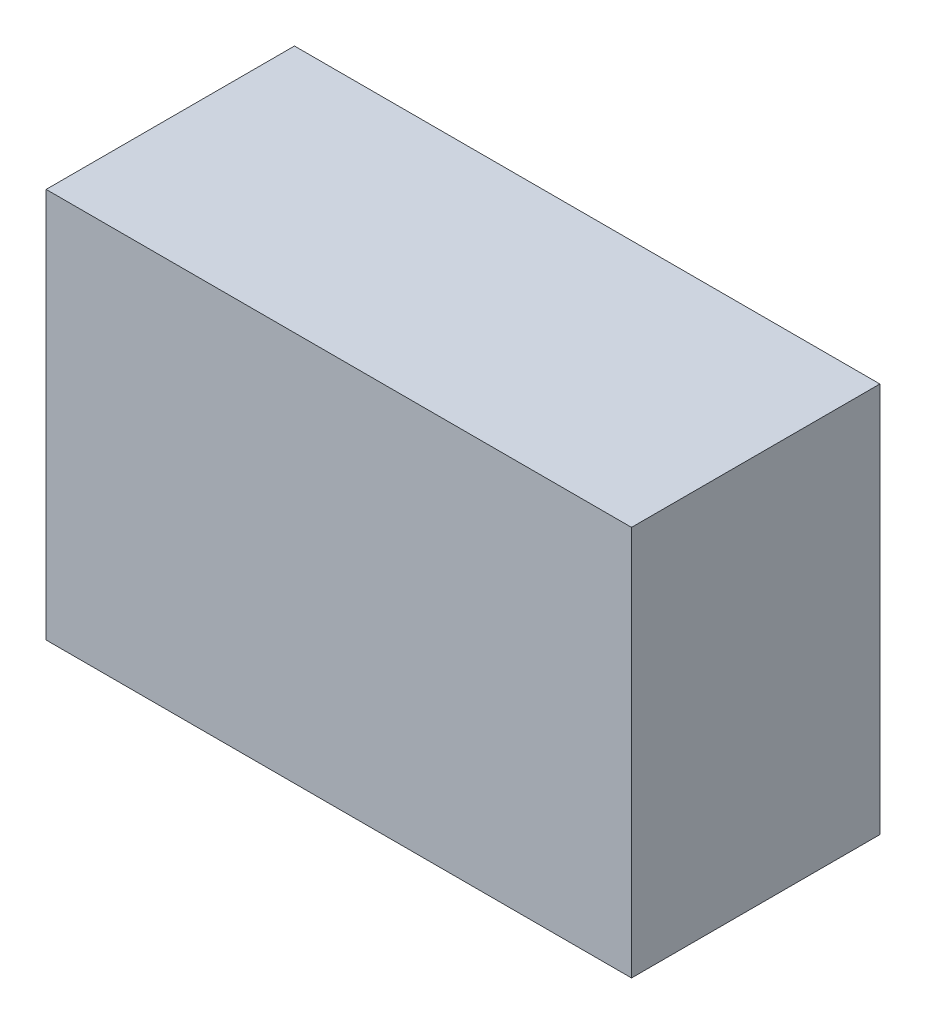
ISO-10303-21;
HEADER;
FILE_DESCRIPTION(('STEP AP214'),'2;1');
FILE_NAME('part.step','',(''),(''),'','','');
FILE_SCHEMA(('AUTOMOTIVE_DESIGN { 1 0 10303 214 1 1 1 1 }'));
ENDSEC;
DATA;
#1=APPLICATION_CONTEXT('core data for automotive mechanical design processes');
#2=APPLICATION_PROTOCOL_DEFINITION('international standard','automotive_design',2000,#1);
#3=PRODUCT_CONTEXT('',#1,'mechanical');
#4=PRODUCT('Part','Part','',(#3));
#5=PRODUCT_RELATED_PRODUCT_CATEGORY('part','',(#4));
#6=PRODUCT_DEFINITION_FORMATION('','',#4);
#7=PRODUCT_DEFINITION_CONTEXT('part definition',#1,'design');
#8=PRODUCT_DEFINITION('design','',#6,#7);
#9=PRODUCT_DEFINITION_SHAPE('','',#8);
#10=(LENGTH_UNIT() NAMED_UNIT(*) SI_UNIT(.MILLI.,.METRE.));
#11=(NAMED_UNIT(*) PLANE_ANGLE_UNIT() SI_UNIT($,.RADIAN.));
#12=(NAMED_UNIT(*) SI_UNIT($,.STERADIAN.) SOLID_ANGLE_UNIT());
#13=UNCERTAINTY_MEASURE_WITH_UNIT(LENGTH_MEASURE(1.E-05),#10,'distance_accuracy_value','');
#14=(GEOMETRIC_REPRESENTATION_CONTEXT(3) GLOBAL_UNCERTAINTY_ASSIGNED_CONTEXT((#13)) GLOBAL_UNIT_ASSIGNED_CONTEXT((#10,
#11,#12)) REPRESENTATION_CONTEXT('',''));
#15=CARTESIAN_POINT('',(0.,0.,0.));
#16=DIRECTION('',(0.,0.,1.));
#17=DIRECTION('',(1.,0.,0.));
#18=AXIS2_PLACEMENT_3D('',#15,#16,#17);
#19=CARTESIAN_POINT('',(0.,0.,3.5));
#20=DIRECTION('',(1.,0.,0.));
#21=DIRECTION('',(0.,0.,-1.));
#22=AXIS2_PLACEMENT_3D('',#19,#20,#21);
#23=PLANE('',#22);
#24=DIRECTION('',(0.,-1.,0.));
#25=VECTOR('',#24,1.);
#26=CARTESIAN_POINT('',(0.,0.,0.));
#27=LINE('',#26,#25);
#28=CARTESIAN_POINT('',(0.,5.5,0.));
#29=VERTEX_POINT('',#28);
#30=CARTESIAN_POINT('',(0.,0.,0.));
#31=VERTEX_POINT('',#30);
#32=EDGE_CURVE('E96',#29,#31,#27,.T.);
#33=ORIENTED_EDGE('',*,*,#32,.T.);
#34=DIRECTION('',(0.,0.,-1.));
#35=VECTOR('',#34,1.);
#36=CARTESIAN_POINT('',(0.,0.,3.5));
#37=LINE('',#36,#35);
#38=CARTESIAN_POINT('',(0.,0.,3.5));
#39=VERTEX_POINT('',#38);
#40=EDGE_CURVE('E11',#39,#31,#37,.T.);
#41=ORIENTED_EDGE('',*,*,#40,.F.);
#42=DIRECTION('',(0.,-1.,0.));
#43=VECTOR('',#42,1.);
#44=CARTESIAN_POINT('',(0.,0.,3.5));
#45=LINE('',#44,#43);
#46=CARTESIAN_POINT('',(0.,5.5,3.5));
#47=VERTEX_POINT('',#46);
#48=EDGE_CURVE('E84',#47,#39,#45,.T.);
#49=ORIENTED_EDGE('',*,*,#48,.F.);
#50=DIRECTION('',(0.,0.,-1.));
#51=VECTOR('',#50,1.);
#52=CARTESIAN_POINT('',(0.,5.5,3.5));
#53=LINE('',#52,#51);
#54=EDGE_CURVE('E92',#47,#29,#53,.T.);
#55=ORIENTED_EDGE('',*,*,#54,.T.);
#56=EDGE_LOOP('',(#33,#41,#49,#55));
#57=FACE_BOUND('',#56,.T.);
#58=ADVANCED_FACE('F33',(#57),#23,.F.);
#59=CARTESIAN_POINT('',(0.,0.,3.5));
#60=DIRECTION('',(0.,1.,0.));
#61=DIRECTION('',(0.,0.,1.));
#62=AXIS2_PLACEMENT_3D('',#59,#60,#61);
#63=PLANE('',#62);
#64=DIRECTION('',(1.,0.,0.));
#65=VECTOR('',#64,1.);
#66=CARTESIAN_POINT('',(0.,0.,0.));
#67=LINE('',#66,#65);
#68=CARTESIAN_POINT('',(8.25,0.,0.));
#69=VERTEX_POINT('',#68);
#70=EDGE_CURVE('E88',#31,#69,#67,.T.);
#71=ORIENTED_EDGE('',*,*,#70,.T.);
#72=DIRECTION('',(0.,0.,-1.));
#73=VECTOR('',#72,1.);
#74=CARTESIAN_POINT('',(8.25,0.,3.5));
#75=LINE('',#74,#73);
#76=CARTESIAN_POINT('',(8.25,0.,3.5));
#77=VERTEX_POINT('',#76);
#78=EDGE_CURVE('E41',#77,#69,#75,.T.);
#79=ORIENTED_EDGE('',*,*,#78,.F.);
#80=DIRECTION('',(1.,0.,0.));
#81=VECTOR('',#80,1.);
#82=CARTESIAN_POINT('',(0.,0.,3.5));
#83=LINE('',#82,#81);
#84=EDGE_CURVE('E79',#39,#77,#83,.T.);
#85=ORIENTED_EDGE('',*,*,#84,.F.);
#86=ORIENTED_EDGE('',*,*,#40,.T.);
#87=EDGE_LOOP('',(#71,#79,#85,#86));
#88=FACE_BOUND('',#87,.T.);
#89=ADVANCED_FACE('F87',(#88),#63,.F.);
#90=CARTESIAN_POINT('',(8.25,0.,3.5));
#91=DIRECTION('',(-1.,0.,0.));
#92=DIRECTION('',(0.,0.,1.));
#93=AXIS2_PLACEMENT_3D('',#90,#91,#92);
#94=PLANE('',#93);
#95=DIRECTION('',(0.,1.,0.));
#96=VECTOR('',#95,1.);
#97=CARTESIAN_POINT('',(8.25,0.,0.));
#98=LINE('',#97,#96);
#99=CARTESIAN_POINT('',(8.25,5.5,0.));
#100=VERTEX_POINT('',#99);
#101=EDGE_CURVE('E66',#69,#100,#98,.T.);
#102=ORIENTED_EDGE('',*,*,#101,.T.);
#103=DIRECTION('',(0.,0.,-1.));
#104=VECTOR('',#103,1.);
#105=CARTESIAN_POINT('',(8.25,5.5,3.5));
#106=LINE('',#105,#104);
#107=CARTESIAN_POINT('',(8.25,5.5,3.5));
#108=VERTEX_POINT('',#107);
#109=EDGE_CURVE('E89',#108,#100,#106,.T.);
#110=ORIENTED_EDGE('',*,*,#109,.F.);
#111=DIRECTION('',(0.,1.,0.));
#112=VECTOR('',#111,1.);
#113=CARTESIAN_POINT('',(8.25,0.,3.5));
#114=LINE('',#113,#112);
#115=EDGE_CURVE('E82',#77,#108,#114,.T.);
#116=ORIENTED_EDGE('',*,*,#115,.F.);
#117=ORIENTED_EDGE('',*,*,#78,.T.);
#118=EDGE_LOOP('',(#102,#110,#116,#117));
#119=FACE_BOUND('',#118,.T.);
#120=ADVANCED_FACE('F90',(#119),#94,.F.);
#121=CARTESIAN_POINT('',(0.,5.5,3.5));
#122=DIRECTION('',(0.,-1.,0.));
#123=DIRECTION('',(0.,0.,-1.));
#124=AXIS2_PLACEMENT_3D('',#121,#122,#123);
#125=PLANE('',#124);
#126=DIRECTION('',(-1.,0.,0.));
#127=VECTOR('',#126,1.);
#128=CARTESIAN_POINT('',(0.,5.5,0.));
#129=LINE('',#128,#127);
#130=EDGE_CURVE('E72',#100,#29,#129,.T.);
#131=ORIENTED_EDGE('',*,*,#130,.T.);
#132=ORIENTED_EDGE('',*,*,#54,.F.);
#133=DIRECTION('',(-1.,0.,0.));
#134=VECTOR('',#133,1.);
#135=CARTESIAN_POINT('',(0.,5.5,3.5));
#136=LINE('',#135,#134);
#137=EDGE_CURVE('E49',#108,#47,#136,.T.);
#138=ORIENTED_EDGE('',*,*,#137,.F.);
#139=ORIENTED_EDGE('',*,*,#109,.T.);
#140=EDGE_LOOP('',(#131,#132,#138,#139));
#141=FACE_BOUND('',#140,.T.);
#142=ADVANCED_FACE('F103',(#141),#125,.F.);
#143=CARTESIAN_POINT('',(0.,0.,3.5));
#144=DIRECTION('',(0.,0.,-1.));
#145=DIRECTION('',(-1.,0.,0.));
#146=AXIS2_PLACEMENT_3D('',#143,#144,#145);
#147=PLANE('',#146);
#148=ORIENTED_EDGE('',*,*,#48,.T.);
#149=ORIENTED_EDGE('',*,*,#84,.T.);
#150=ORIENTED_EDGE('',*,*,#115,.T.);
#151=ORIENTED_EDGE('',*,*,#137,.T.);
#152=EDGE_LOOP('',(#148,#149,#150,#151));
#153=FACE_BOUND('',#152,.T.);
#154=ADVANCED_FACE('F80',(#153),#147,.F.);
#155=CARTESIAN_POINT('',(0.,0.,0.));
#156=DIRECTION('',(0.,0.,-1.));
#157=DIRECTION('',(-1.,0.,0.));
#158=AXIS2_PLACEMENT_3D('',#155,#156,#157);
#159=PLANE('',#158);
#160=ORIENTED_EDGE('',*,*,#32,.F.);
#161=ORIENTED_EDGE('',*,*,#130,.F.);
#162=ORIENTED_EDGE('',*,*,#101,.F.);
#163=ORIENTED_EDGE('',*,*,#70,.F.);
#164=EDGE_LOOP('',(#160,#161,#162,#163));
#165=FACE_BOUND('',#164,.T.);
#166=ADVANCED_FACE('F106',(#165),#159,.T.);
#167=CLOSED_SHELL('',(#58,#89,#120,#142,#154,#166));
#168=MANIFOLD_SOLID_BREP('B2',#167);
#169=ADVANCED_BREP_SHAPE_REPRESENTATION('',(#18,#168),#14);
#170=SHAPE_DEFINITION_REPRESENTATION(#9,#169);
ENDSEC;
END-ISO-10303-21;
